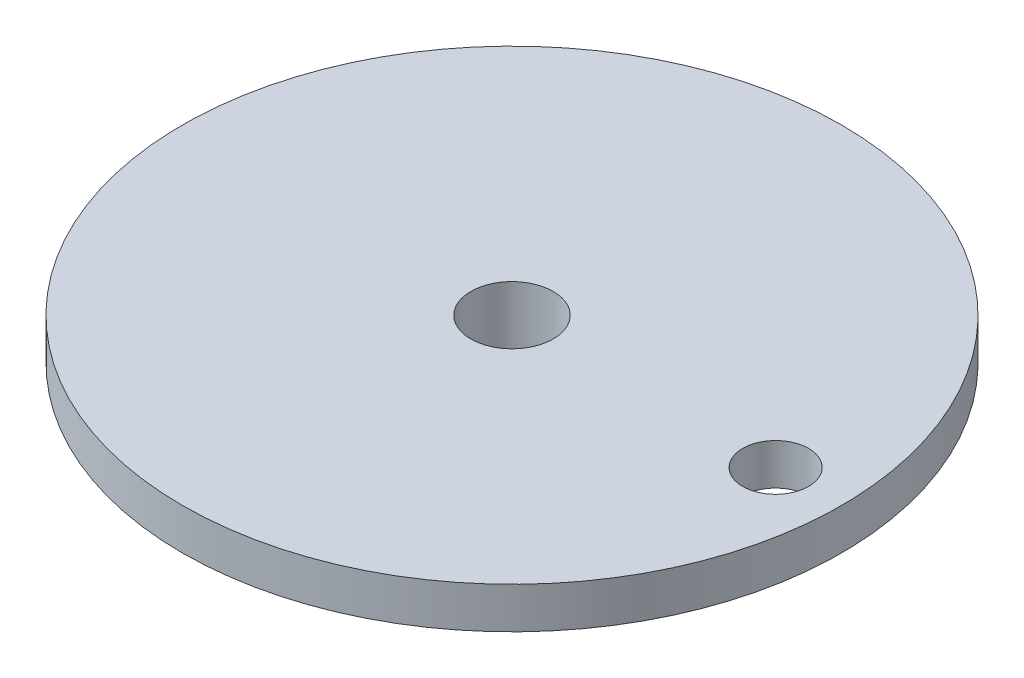
ISO-10303-21;
HEADER;
FILE_DESCRIPTION(('STEP AP214'),'2;1');
FILE_NAME('part.step','',(''),(''),'','','');
FILE_SCHEMA(('AUTOMOTIVE_DESIGN { 1 0 10303 214 1 1 1 1 }'));
ENDSEC;
DATA;
#1=APPLICATION_CONTEXT('core data for automotive mechanical design processes');
#2=APPLICATION_PROTOCOL_DEFINITION('international standard','automotive_design',2000,#1);
#3=PRODUCT_CONTEXT('',#1,'mechanical');
#4=PRODUCT('Part','Part','',(#3));
#5=PRODUCT_RELATED_PRODUCT_CATEGORY('part','',(#4));
#6=PRODUCT_DEFINITION_FORMATION('','',#4);
#7=PRODUCT_DEFINITION_CONTEXT('part definition',#1,'design');
#8=PRODUCT_DEFINITION('design','',#6,#7);
#9=PRODUCT_DEFINITION_SHAPE('','',#8);
#10=(LENGTH_UNIT() NAMED_UNIT(*) SI_UNIT(.MILLI.,.METRE.));
#11=(NAMED_UNIT(*) PLANE_ANGLE_UNIT() SI_UNIT($,.RADIAN.));
#12=(NAMED_UNIT(*) SI_UNIT($,.STERADIAN.) SOLID_ANGLE_UNIT());
#13=UNCERTAINTY_MEASURE_WITH_UNIT(LENGTH_MEASURE(1.E-05),#10,'distance_accuracy_value','');
#14=(GEOMETRIC_REPRESENTATION_CONTEXT(3) GLOBAL_UNCERTAINTY_ASSIGNED_CONTEXT((#13)) GLOBAL_UNIT_ASSIGNED_CONTEXT((#10,
#11,#12)) REPRESENTATION_CONTEXT('',''));
#15=CARTESIAN_POINT('',(0.,0.,0.));
#16=DIRECTION('',(0.,0.,1.));
#17=DIRECTION('',(1.,0.,0.));
#18=AXIS2_PLACEMENT_3D('',#15,#16,#17);
#19=CARTESIAN_POINT('',(0.,5.,0.));
#20=DIRECTION('',(0.,-1.,0.));
#21=DIRECTION('',(0.,0.,-1.));
#22=AXIS2_PLACEMENT_3D('',#19,#20,#21);
#23=CYLINDRICAL_SURFACE('',#22,40.);
#24=CARTESIAN_POINT('',(0.,5.,0.));
#25=DIRECTION('',(0.,1.,0.));
#26=DIRECTION('',(0.,0.,1.));
#27=AXIS2_PLACEMENT_3D('',#24,#25,#26);
#28=CIRCLE('',#27,40.);
#29=CARTESIAN_POINT('',(0.,5.,40.));
#30=VERTEX_POINT('',#29);
#31=EDGE_CURVE('E44',#30,#30,#28,.T.);
#32=ORIENTED_EDGE('',*,*,#31,.F.);
#33=EDGE_LOOP('',(#32));
#34=FACE_BOUND('',#33,.T.);
#35=CARTESIAN_POINT('',(0.,0.,0.));
#36=DIRECTION('',(0.,1.,0.));
#37=DIRECTION('',(0.,0.,1.));
#38=AXIS2_PLACEMENT_3D('',#35,#36,#37);
#39=CIRCLE('',#38,40.);
#40=CARTESIAN_POINT('',(0.,0.,40.));
#41=VERTEX_POINT('',#40);
#42=EDGE_CURVE('E40',#41,#41,#39,.T.);
#43=ORIENTED_EDGE('',*,*,#42,.T.);
#44=EDGE_LOOP('',(#43));
#45=FACE_BOUND('',#44,.T.);
#46=ADVANCED_FACE('F37',(#34,#45),#23,.T.);
#47=CARTESIAN_POINT('',(0.,5.,0.));
#48=DIRECTION('',(0.,1.,0.));
#49=DIRECTION('',(0.,0.,1.));
#50=AXIS2_PLACEMENT_3D('',#47,#48,#49);
#51=PLANE('',#50);
#52=CARTESIAN_POINT('',(32.,5.,0.));
#53=DIRECTION('',(0.,-1.,0.));
#54=DIRECTION('',(0.,0.,-1.));
#55=AXIS2_PLACEMENT_3D('',#52,#53,#54);
#56=CIRCLE('',#55,4.00000000000001);
#57=CARTESIAN_POINT('',(32.,5.,-4.00000000000001));
#58=VERTEX_POINT('',#57);
#59=EDGE_CURVE('E57',#58,#58,#56,.T.);
#60=ORIENTED_EDGE('',*,*,#59,.T.);
#61=EDGE_LOOP('',(#60));
#62=FACE_BOUND('',#61,.T.);
#63=CARTESIAN_POINT('',(0.,5.,0.));
#64=DIRECTION('',(0.,-1.,0.));
#65=DIRECTION('',(0.,0.,-1.));
#66=AXIS2_PLACEMENT_3D('',#63,#64,#65);
#67=CIRCLE('',#66,5.);
#68=CARTESIAN_POINT('',(0.,5.,-5.));
#69=VERTEX_POINT('',#68);
#70=EDGE_CURVE('E53',#69,#69,#67,.T.);
#71=ORIENTED_EDGE('',*,*,#70,.T.);
#72=EDGE_LOOP('',(#71));
#73=FACE_BOUND('',#72,.T.);
#74=ORIENTED_EDGE('',*,*,#31,.T.);
#75=EDGE_LOOP('',(#74));
#76=FACE_BOUND('',#75,.T.);
#77=ADVANCED_FACE('F66',(#62,#73,#76),#51,.T.);
#78=CARTESIAN_POINT('',(0.,0.,0.));
#79=DIRECTION('',(0.,1.,0.));
#80=DIRECTION('',(0.,0.,1.));
#81=AXIS2_PLACEMENT_3D('',#78,#79,#80);
#82=PLANE('',#81);
#83=CARTESIAN_POINT('',(32.,0.,0.));
#84=DIRECTION('',(0.,-1.,0.));
#85=DIRECTION('',(0.,0.,-1.));
#86=AXIS2_PLACEMENT_3D('',#83,#84,#85);
#87=CIRCLE('',#86,4.00000000000001);
#88=CARTESIAN_POINT('',(32.,0.,-4.00000000000001));
#89=VERTEX_POINT('',#88);
#90=EDGE_CURVE('E60',#89,#89,#87,.T.);
#91=ORIENTED_EDGE('',*,*,#90,.F.);
#92=EDGE_LOOP('',(#91));
#93=FACE_BOUND('',#92,.T.);
#94=CARTESIAN_POINT('',(0.,0.,0.));
#95=DIRECTION('',(0.,-1.,0.));
#96=DIRECTION('',(0.,0.,-1.));
#97=AXIS2_PLACEMENT_3D('',#94,#95,#96);
#98=CIRCLE('',#97,11.);
#99=CARTESIAN_POINT('',(0.,0.,-11.));
#100=VERTEX_POINT('',#99);
#101=EDGE_CURVE('E10',#100,#100,#98,.T.);
#102=ORIENTED_EDGE('',*,*,#101,.F.);
#103=EDGE_LOOP('',(#102));
#104=FACE_BOUND('',#103,.T.);
#105=ORIENTED_EDGE('',*,*,#42,.F.);
#106=EDGE_LOOP('',(#105));
#107=FACE_BOUND('',#106,.T.);
#108=ADVANCED_FACE('F76',(#93,#104,#107),#82,.F.);
#109=CARTESIAN_POINT('',(0.,-5.,0.));
#110=DIRECTION('',(0.,1.,0.));
#111=DIRECTION('',(0.,0.,1.));
#112=AXIS2_PLACEMENT_3D('',#109,#110,#111);
#113=CYLINDRICAL_SURFACE('',#112,11.);
#114=CARTESIAN_POINT('',(0.,-5.,0.));
#115=DIRECTION('',(0.,-1.,0.));
#116=DIRECTION('',(0.,0.,-1.));
#117=AXIS2_PLACEMENT_3D('',#114,#115,#116);
#118=CIRCLE('',#117,11.);
#119=CARTESIAN_POINT('',(0.,-5.,-11.));
#120=VERTEX_POINT('',#119);
#121=EDGE_CURVE('E50',#120,#120,#118,.T.);
#122=ORIENTED_EDGE('',*,*,#121,.F.);
#123=EDGE_LOOP('',(#122));
#124=FACE_BOUND('',#123,.T.);
#125=ORIENTED_EDGE('',*,*,#101,.T.);
#126=EDGE_LOOP('',(#125));
#127=FACE_BOUND('',#126,.T.);
#128=ADVANCED_FACE('F79',(#124,#127),#113,.T.);
#129=CARTESIAN_POINT('',(0.,-5.,0.));
#130=DIRECTION('',(0.,-1.,0.));
#131=DIRECTION('',(0.,0.,-1.));
#132=AXIS2_PLACEMENT_3D('',#129,#130,#131);
#133=PLANE('',#132);
#134=CARTESIAN_POINT('',(0.,-5.,0.));
#135=DIRECTION('',(0.,-1.,0.));
#136=DIRECTION('',(0.,0.,-1.));
#137=AXIS2_PLACEMENT_3D('',#134,#135,#136);
#138=CIRCLE('',#137,5.);
#139=CARTESIAN_POINT('',(0.,-5.,-5.));
#140=VERTEX_POINT('',#139);
#141=EDGE_CURVE('E54',#140,#140,#138,.T.);
#142=ORIENTED_EDGE('',*,*,#141,.F.);
#143=EDGE_LOOP('',(#142));
#144=FACE_BOUND('',#143,.T.);
#145=ORIENTED_EDGE('',*,*,#121,.T.);
#146=EDGE_LOOP('',(#145));
#147=FACE_BOUND('',#146,.T.);
#148=ADVANCED_FACE('F98',(#144,#147),#133,.T.);
#149=CARTESIAN_POINT('',(0.,5.,0.));
#150=DIRECTION('',(0.,-1.,0.));
#151=DIRECTION('',(0.,0.,-1.));
#152=AXIS2_PLACEMENT_3D('',#149,#150,#151);
#153=CYLINDRICAL_SURFACE('',#152,5.);
#154=ORIENTED_EDGE('',*,*,#70,.F.);
#155=EDGE_LOOP('',(#154));
#156=FACE_BOUND('',#155,.T.);
#157=ORIENTED_EDGE('',*,*,#141,.T.);
#158=EDGE_LOOP('',(#157));
#159=FACE_BOUND('',#158,.T.);
#160=ADVANCED_FACE('F72',(#156,#159),#153,.F.);
#161=CARTESIAN_POINT('',(32.,5.,0.));
#162=DIRECTION('',(0.,-1.,0.));
#163=DIRECTION('',(0.,0.,-1.));
#164=AXIS2_PLACEMENT_3D('',#161,#162,#163);
#165=CYLINDRICAL_SURFACE('',#164,4.00000000000001);
#166=ORIENTED_EDGE('',*,*,#59,.F.);
#167=EDGE_LOOP('',(#166));
#168=FACE_BOUND('',#167,.T.);
#169=ORIENTED_EDGE('',*,*,#90,.T.);
#170=EDGE_LOOP('',(#169));
#171=FACE_BOUND('',#170,.T.);
#172=ADVANCED_FACE('F69',(#168,#171),#165,.F.);
#173=CLOSED_SHELL('',(#46,#77,#108,#128,#148,#160,#172));
#174=MANIFOLD_SOLID_BREP('B2',#173);
#175=ADVANCED_BREP_SHAPE_REPRESENTATION('',(#18,#174),#14);
#176=SHAPE_DEFINITION_REPRESENTATION(#9,#175);
ENDSEC;
END-ISO-10303-21;
